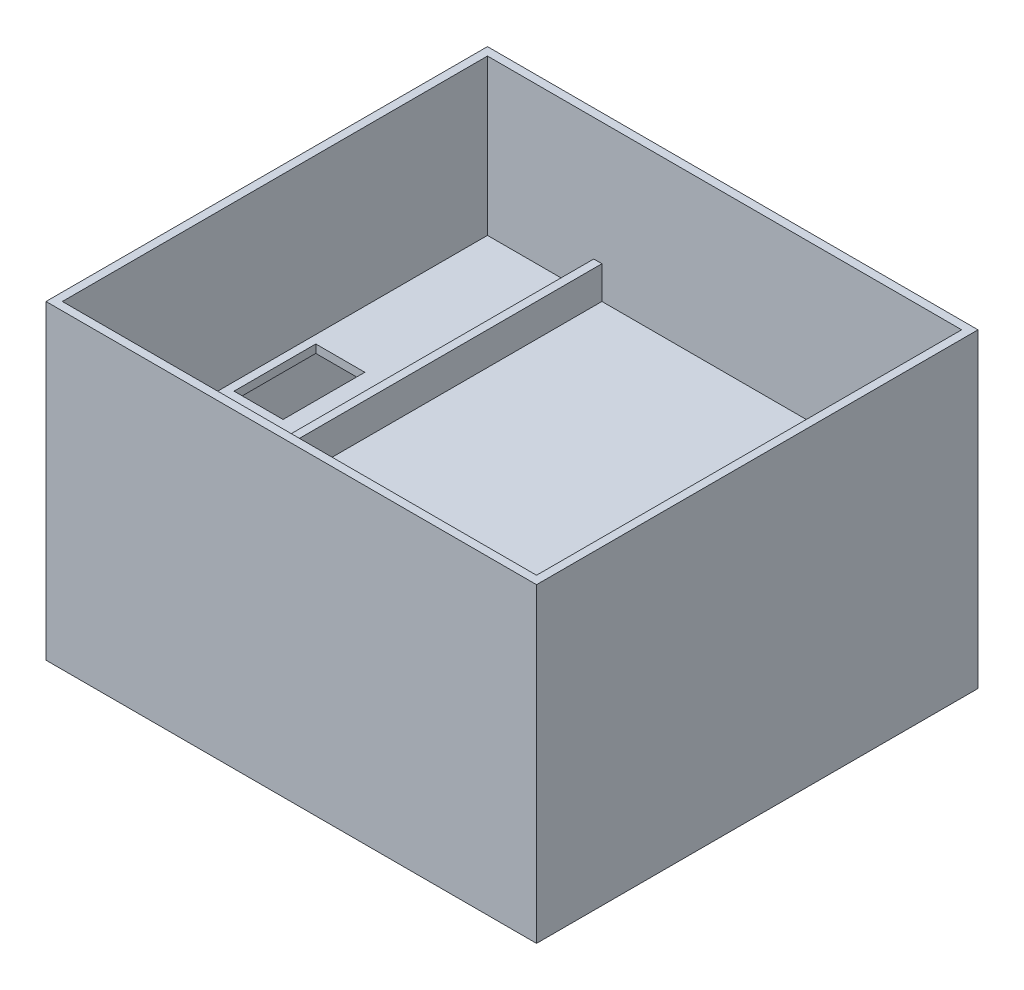
ISO-10303-21;
HEADER;
FILE_DESCRIPTION(('STEP AP214'),'2;1');
FILE_NAME('part.step','',(''),(''),'','','');
FILE_SCHEMA(('AUTOMOTIVE_DESIGN { 1 0 10303 214 1 1 1 1 }'));
ENDSEC;
DATA;
#1=APPLICATION_CONTEXT('core data for automotive mechanical design processes');
#2=APPLICATION_PROTOCOL_DEFINITION('international standard','automotive_design',2000,#1);
#3=PRODUCT_CONTEXT('',#1,'mechanical');
#4=PRODUCT('Part','Part','',(#3));
#5=PRODUCT_RELATED_PRODUCT_CATEGORY('part','',(#4));
#6=PRODUCT_DEFINITION_FORMATION('','',#4);
#7=PRODUCT_DEFINITION_CONTEXT('part definition',#1,'design');
#8=PRODUCT_DEFINITION('design','',#6,#7);
#9=PRODUCT_DEFINITION_SHAPE('','',#8);
#10=(LENGTH_UNIT() NAMED_UNIT(*) SI_UNIT(.MILLI.,.METRE.));
#11=(NAMED_UNIT(*) PLANE_ANGLE_UNIT() SI_UNIT($,.RADIAN.));
#12=(NAMED_UNIT(*) SI_UNIT($,.STERADIAN.) SOLID_ANGLE_UNIT());
#13=UNCERTAINTY_MEASURE_WITH_UNIT(LENGTH_MEASURE(1.E-05),#10,'distance_accuracy_value','');
#14=(GEOMETRIC_REPRESENTATION_CONTEXT(3) GLOBAL_UNCERTAINTY_ASSIGNED_CONTEXT((#13)) GLOBAL_UNIT_ASSIGNED_CONTEXT((#10,
#11,#12)) REPRESENTATION_CONTEXT('',''));
#15=CARTESIAN_POINT('',(0.,0.,0.));
#16=DIRECTION('',(0.,0.,1.));
#17=DIRECTION('',(1.,0.,0.));
#18=AXIS2_PLACEMENT_3D('',#15,#16,#17);
#19=CARTESIAN_POINT('',(-111.874465942488,56.,39.9464352017778));
#20=DIRECTION('',(-1.,0.,0.));
#21=DIRECTION('',(0.,0.,1.));
#22=AXIS2_PLACEMENT_3D('',#19,#20,#21);
#23=PLANE('',#22);
#24=DIRECTION('',(0.,0.,-1.));
#25=VECTOR('',#24,1.);
#26=CARTESIAN_POINT('',(-111.874465942488,19.,39.9464352017778));
#27=LINE('',#26,#25);
#28=CARTESIAN_POINT('',(-111.874465942488,19.,39.9464352017778));
#29=VERTEX_POINT('',#28);
#30=CARTESIAN_POINT('',(-111.874465942488,19.,29.9464352017778));
#31=VERTEX_POINT('',#30);
#32=EDGE_CURVE('E47',#29,#31,#27,.T.);
#33=ORIENTED_EDGE('',*,*,#32,.F.);
#34=DIRECTION('',(0.,-1.,0.));
#35=VECTOR('',#34,1.);
#36=CARTESIAN_POINT('',(-111.874465942488,56.,39.9464352017778));
#37=LINE('',#36,#35);
#38=CARTESIAN_POINT('',(-111.874465942488,18.,39.9464352017778));
#39=VERTEX_POINT('',#38);
#40=EDGE_CURVE('E232',#29,#39,#37,.T.);
#41=ORIENTED_EDGE('',*,*,#40,.T.);
#42=DIRECTION('',(0.,0.,-1.));
#43=VECTOR('',#42,1.);
#44=CARTESIAN_POINT('',(-111.874465942488,18.,39.9464352017778));
#45=LINE('',#44,#43);
#46=CARTESIAN_POINT('',(-111.874465942488,18.,29.9464352017778));
#47=VERTEX_POINT('',#46);
#48=EDGE_CURVE('E182',#39,#47,#45,.T.);
#49=ORIENTED_EDGE('',*,*,#48,.T.);
#50=DIRECTION('',(0.,-1.,0.));
#51=VECTOR('',#50,1.);
#52=CARTESIAN_POINT('',(-111.874465942488,56.,29.9464352017778));
#53=LINE('',#52,#51);
#54=EDGE_CURVE('E231',#31,#47,#53,.T.);
#55=ORIENTED_EDGE('',*,*,#54,.F.);
#56=EDGE_LOOP('',(#33,#41,#49,#55));
#57=FACE_BOUND('',#56,.T.);
#58=ADVANCED_FACE('F33',(#57),#23,.F.);
#59=CARTESIAN_POINT('',(-111.874465942488,56.,39.9464352017778));
#60=DIRECTION('',(0.,0.,1.));
#61=DIRECTION('',(1.,0.,0.));
#62=AXIS2_PLACEMENT_3D('',#59,#60,#61);
#63=PLANE('',#62);
#64=DIRECTION('',(-1.,0.,0.));
#65=VECTOR('',#64,1.);
#66=CARTESIAN_POINT('',(-111.874465942488,19.,39.9464352017778));
#67=LINE('',#66,#65);
#68=CARTESIAN_POINT('',(-105.874465942488,19.,39.9464352017778));
#69=VERTEX_POINT('',#68);
#70=EDGE_CURVE('E210',#69,#29,#67,.T.);
#71=ORIENTED_EDGE('',*,*,#70,.F.);
#72=DIRECTION('',(0.,-1.,0.));
#73=VECTOR('',#72,1.);
#74=CARTESIAN_POINT('',(-105.874465942488,56.,39.9464352017778));
#75=LINE('',#74,#73);
#76=CARTESIAN_POINT('',(-105.874465942488,18.,39.9464352017778));
#77=VERTEX_POINT('',#76);
#78=EDGE_CURVE('E235',#69,#77,#75,.T.);
#79=ORIENTED_EDGE('',*,*,#78,.T.);
#80=DIRECTION('',(-1.,0.,0.));
#81=VECTOR('',#80,1.);
#82=CARTESIAN_POINT('',(-111.874465942488,18.,39.9464352017778));
#83=LINE('',#82,#81);
#84=EDGE_CURVE('E228',#77,#39,#83,.T.);
#85=ORIENTED_EDGE('',*,*,#84,.T.);
#86=ORIENTED_EDGE('',*,*,#40,.F.);
#87=EDGE_LOOP('',(#71,#79,#85,#86));
#88=FACE_BOUND('',#87,.T.);
#89=ADVANCED_FACE('F361',(#88),#63,.F.);
#90=CARTESIAN_POINT('',(-105.874465942488,56.,39.9464352017778));
#91=DIRECTION('',(1.,0.,0.));
#92=DIRECTION('',(0.,0.,-1.));
#93=AXIS2_PLACEMENT_3D('',#90,#91,#92);
#94=PLANE('',#93);
#95=DIRECTION('',(0.,0.,1.));
#96=VECTOR('',#95,1.);
#97=CARTESIAN_POINT('',(-105.874465942488,19.,39.9464352017778));
#98=LINE('',#97,#96);
#99=CARTESIAN_POINT('',(-105.874465942488,19.,29.9464352017778));
#100=VERTEX_POINT('',#99);
#101=EDGE_CURVE('E207',#100,#69,#98,.T.);
#102=ORIENTED_EDGE('',*,*,#101,.F.);
#103=DIRECTION('',(0.,-1.,0.));
#104=VECTOR('',#103,1.);
#105=CARTESIAN_POINT('',(-105.874465942488,56.,29.9464352017778));
#106=LINE('',#105,#104);
#107=CARTESIAN_POINT('',(-105.874465942488,18.,29.9464352017778));
#108=VERTEX_POINT('',#107);
#109=EDGE_CURVE('E237',#100,#108,#106,.T.);
#110=ORIENTED_EDGE('',*,*,#109,.T.);
#111=DIRECTION('',(0.,0.,1.));
#112=VECTOR('',#111,1.);
#113=CARTESIAN_POINT('',(-105.874465942488,18.,39.9464352017778));
#114=LINE('',#113,#112);
#115=EDGE_CURVE('E225',#108,#77,#114,.T.);
#116=ORIENTED_EDGE('',*,*,#115,.T.);
#117=ORIENTED_EDGE('',*,*,#78,.F.);
#118=EDGE_LOOP('',(#102,#110,#116,#117));
#119=FACE_BOUND('',#118,.T.);
#120=ADVANCED_FACE('F367',(#119),#94,.F.);
#121=CARTESIAN_POINT('',(-111.874465942488,56.,29.9464352017778));
#122=DIRECTION('',(0.,0.,-1.));
#123=DIRECTION('',(-1.,0.,0.));
#124=AXIS2_PLACEMENT_3D('',#121,#122,#123);
#125=PLANE('',#124);
#126=DIRECTION('',(1.,0.,0.));
#127=VECTOR('',#126,1.);
#128=CARTESIAN_POINT('',(-111.874465942488,19.,29.9464352017778));
#129=LINE('',#128,#127);
#130=EDGE_CURVE('E11',#31,#100,#129,.T.);
#131=ORIENTED_EDGE('',*,*,#130,.F.);
#132=ORIENTED_EDGE('',*,*,#54,.T.);
#133=DIRECTION('',(1.,0.,0.));
#134=VECTOR('',#133,1.);
#135=CARTESIAN_POINT('',(-111.874465942488,18.,29.9464352017778));
#136=LINE('',#135,#134);
#137=EDGE_CURVE('E222',#47,#108,#136,.T.);
#138=ORIENTED_EDGE('',*,*,#137,.T.);
#139=ORIENTED_EDGE('',*,*,#109,.F.);
#140=EDGE_LOOP('',(#131,#132,#138,#139));
#141=FACE_BOUND('',#140,.T.);
#142=ADVANCED_FACE('F372',(#141),#125,.F.);
#143=CARTESIAN_POINT('',(-98.8744659424876,19.,7.9464352017778));
#144=DIRECTION('',(-1.,0.,0.));
#145=DIRECTION('',(0.,0.,1.));
#146=AXIS2_PLACEMENT_3D('',#143,#144,#145);
#147=PLANE('',#146);
#148=DIRECTION('',(0.,0.,-1.));
#149=VECTOR('',#148,1.);
#150=CARTESIAN_POINT('',(-98.8744659424876,23.,59.9464352017778));
#151=LINE('',#150,#149);
#152=CARTESIAN_POINT('',(-98.8744659424876,23.,59.9464352017778));
#153=VERTEX_POINT('',#152);
#154=CARTESIAN_POINT('',(-98.8744659424876,23.,7.9464352017778));
#155=VERTEX_POINT('',#154);
#156=EDGE_CURVE('E55',#153,#155,#151,.T.);
#157=ORIENTED_EDGE('',*,*,#156,.F.);
#158=DIRECTION('',(0.,1.,0.));
#159=VECTOR('',#158,1.);
#160=CARTESIAN_POINT('',(-98.8744659424876,19.,59.9464352017778));
#161=LINE('',#160,#159);
#162=CARTESIAN_POINT('',(-98.8744659424876,19.,59.9464352017778));
#163=VERTEX_POINT('',#162);
#164=EDGE_CURVE('E293',#163,#153,#161,.T.);
#165=ORIENTED_EDGE('',*,*,#164,.F.);
#166=DIRECTION('',(0.,0.,1.));
#167=VECTOR('',#166,1.);
#168=CARTESIAN_POINT('',(-98.8744659424876,19.,7.9464352017778));
#169=LINE('',#168,#167);
#170=CARTESIAN_POINT('',(-98.8744659424876,19.,7.9464352017778));
#171=VERTEX_POINT('',#170);
#172=EDGE_CURVE('E279',#171,#163,#169,.T.);
#173=ORIENTED_EDGE('',*,*,#172,.F.);
#174=DIRECTION('',(0.,1.,0.));
#175=VECTOR('',#174,1.);
#176=CARTESIAN_POINT('',(-98.8744659424876,19.,7.9464352017778));
#177=LINE('',#176,#175);
#178=EDGE_CURVE('E296',#171,#155,#177,.T.);
#179=ORIENTED_EDGE('',*,*,#178,.T.);
#180=EDGE_LOOP('',(#157,#165,#173,#179));
#181=FACE_BOUND('',#180,.T.);
#182=ADVANCED_FACE('F402',(#181),#147,.F.);
#183=CARTESIAN_POINT('',(-113.874465942488,38.,60.9464352017778));
#184=DIRECTION('',(1.,0.,0.));
#185=DIRECTION('',(0.,0.,-1.));
#186=AXIS2_PLACEMENT_3D('',#183,#184,#185);
#187=PLANE('',#186);
#188=DIRECTION('',(0.,0.,1.));
#189=VECTOR('',#188,1.);
#190=CARTESIAN_POINT('',(-113.874465942488,0.,60.9464352017778));
#191=LINE('',#190,#189);
#192=CARTESIAN_POINT('',(-113.874465942488,0.,6.9464352017778));
#193=VERTEX_POINT('',#192);
#194=CARTESIAN_POINT('',(-113.874465942488,0.,60.9464352017778));
#195=VERTEX_POINT('',#194);
#196=EDGE_CURVE('E292',#193,#195,#191,.T.);
#197=ORIENTED_EDGE('',*,*,#196,.T.);
#198=DIRECTION('',(0.,-1.,0.));
#199=VECTOR('',#198,1.);
#200=CARTESIAN_POINT('',(-113.874465942488,38.,60.9464352017778));
#201=LINE('',#200,#199);
#202=CARTESIAN_POINT('',(-113.874465942488,38.,60.9464352017778));
#203=VERTEX_POINT('',#202);
#204=EDGE_CURVE('E41',#203,#195,#201,.T.);
#205=ORIENTED_EDGE('',*,*,#204,.F.);
#206=DIRECTION('',(0.,0.,1.));
#207=VECTOR('',#206,1.);
#208=CARTESIAN_POINT('',(-113.874465942488,38.,60.9464352017778));
#209=LINE('',#208,#207);
#210=CARTESIAN_POINT('',(-113.874465942488,38.,6.9464352017778));
#211=VERTEX_POINT('',#210);
#212=EDGE_CURVE('E301',#211,#203,#209,.T.);
#213=ORIENTED_EDGE('',*,*,#212,.F.);
#214=DIRECTION('',(0.,-1.,0.));
#215=VECTOR('',#214,1.);
#216=CARTESIAN_POINT('',(-113.874465942488,38.,6.9464352017778));
#217=LINE('',#216,#215);
#218=EDGE_CURVE('E311',#211,#193,#217,.T.);
#219=ORIENTED_EDGE('',*,*,#218,.T.);
#220=EDGE_LOOP('',(#197,#205,#213,#219));
#221=FACE_BOUND('',#220,.T.);
#222=ADVANCED_FACE('F35',(#221),#187,.F.);
#223=CARTESIAN_POINT('',(-113.874465942488,38.,60.9464352017778));
#224=DIRECTION('',(0.,0.,-1.));
#225=DIRECTION('',(-1.,0.,0.));
#226=AXIS2_PLACEMENT_3D('',#223,#224,#225);
#227=PLANE('',#226);
#228=DIRECTION('',(1.,0.,0.));
#229=VECTOR('',#228,1.);
#230=CARTESIAN_POINT('',(-113.874465942488,0.,60.9464352017778));
#231=LINE('',#230,#229);
#232=CARTESIAN_POINT('',(-53.8744659424876,0.,60.9464352017778));
#233=VERTEX_POINT('',#232);
#234=EDGE_CURVE('E314',#195,#233,#231,.T.);
#235=ORIENTED_EDGE('',*,*,#234,.T.);
#236=DIRECTION('',(0.,-1.,0.));
#237=VECTOR('',#236,1.);
#238=CARTESIAN_POINT('',(-53.8744659424876,38.,60.9464352017778));
#239=LINE('',#238,#237);
#240=CARTESIAN_POINT('',(-53.8744659424876,38.,60.9464352017778));
#241=VERTEX_POINT('',#240);
#242=EDGE_CURVE('E324',#241,#233,#239,.T.);
#243=ORIENTED_EDGE('',*,*,#242,.F.);
#244=DIRECTION('',(1.,0.,0.));
#245=VECTOR('',#244,1.);
#246=CARTESIAN_POINT('',(-113.874465942488,38.,60.9464352017778));
#247=LINE('',#246,#245);
#248=EDGE_CURVE('E304',#203,#241,#247,.T.);
#249=ORIENTED_EDGE('',*,*,#248,.F.);
#250=ORIENTED_EDGE('',*,*,#204,.T.);
#251=EDGE_LOOP('',(#235,#243,#249,#250));
#252=FACE_BOUND('',#251,.T.);
#253=ADVANCED_FACE('F329',(#252),#227,.F.);
#254=CARTESIAN_POINT('',(-53.8744659424876,38.,60.9464352017778));
#255=DIRECTION('',(-1.,0.,0.));
#256=DIRECTION('',(0.,0.,1.));
#257=AXIS2_PLACEMENT_3D('',#254,#255,#256);
#258=PLANE('',#257);
#259=DIRECTION('',(0.,0.,-1.));
#260=VECTOR('',#259,1.);
#261=CARTESIAN_POINT('',(-53.8744659424876,0.,60.9464352017778));
#262=LINE('',#261,#260);
#263=CARTESIAN_POINT('',(-53.8744659424876,0.,6.9464352017778));
#264=VERTEX_POINT('',#263);
#265=EDGE_CURVE('E316',#233,#264,#262,.T.);
#266=ORIENTED_EDGE('',*,*,#265,.T.);
#267=DIRECTION('',(0.,-1.,0.));
#268=VECTOR('',#267,1.);
#269=CARTESIAN_POINT('',(-53.8744659424876,38.,6.9464352017778));
#270=LINE('',#269,#268);
#271=CARTESIAN_POINT('',(-53.8744659424876,38.,6.9464352017778));
#272=VERTEX_POINT('',#271);
#273=EDGE_CURVE('E321',#272,#264,#270,.T.);
#274=ORIENTED_EDGE('',*,*,#273,.F.);
#275=DIRECTION('',(0.,0.,-1.));
#276=VECTOR('',#275,1.);
#277=CARTESIAN_POINT('',(-53.8744659424876,38.,60.9464352017778));
#278=LINE('',#277,#276);
#279=EDGE_CURVE('E307',#241,#272,#278,.T.);
#280=ORIENTED_EDGE('',*,*,#279,.F.);
#281=ORIENTED_EDGE('',*,*,#242,.T.);
#282=EDGE_LOOP('',(#266,#274,#280,#281));
#283=FACE_BOUND('',#282,.T.);
#284=ADVANCED_FACE('F341',(#283),#258,.F.);
#285=CARTESIAN_POINT('',(-113.874465942488,38.,6.9464352017778));
#286=DIRECTION('',(0.,0.,1.));
#287=DIRECTION('',(1.,0.,0.));
#288=AXIS2_PLACEMENT_3D('',#285,#286,#287);
#289=PLANE('',#288);
#290=DIRECTION('',(-1.,0.,0.));
#291=VECTOR('',#290,1.);
#292=CARTESIAN_POINT('',(-113.874465942488,0.,6.9464352017778));
#293=LINE('',#292,#291);
#294=EDGE_CURVE('E305',#264,#193,#293,.T.);
#295=ORIENTED_EDGE('',*,*,#294,.T.);
#296=ORIENTED_EDGE('',*,*,#218,.F.);
#297=DIRECTION('',(-1.,0.,0.));
#298=VECTOR('',#297,1.);
#299=CARTESIAN_POINT('',(-113.874465942488,38.,6.9464352017778));
#300=LINE('',#299,#298);
#301=EDGE_CURVE('E309',#272,#211,#300,.T.);
#302=ORIENTED_EDGE('',*,*,#301,.F.);
#303=ORIENTED_EDGE('',*,*,#273,.T.);
#304=EDGE_LOOP('',(#295,#296,#302,#303));
#305=FACE_BOUND('',#304,.T.);
#306=ADVANCED_FACE('F345',(#305),#289,.F.);
#307=CARTESIAN_POINT('',(0.,38.,0.));
#308=DIRECTION('',(0.,-1.,0.));
#309=DIRECTION('',(0.,0.,-1.));
#310=AXIS2_PLACEMENT_3D('',#307,#308,#309);
#311=PLANE('',#310);
#312=DIRECTION('',(1.,0.,0.));
#313=VECTOR('',#312,1.);
#314=CARTESIAN_POINT('',(-54.8744659424876,38.,59.9464352017778));
#315=LINE('',#314,#313);
#316=CARTESIAN_POINT('',(-112.874465942488,38.,59.9464352017778));
#317=VERTEX_POINT('',#316);
#318=CARTESIAN_POINT('',(-54.8744659424876,38.,59.9464352017778));
#319=VERTEX_POINT('',#318);
#320=EDGE_CURVE('E276',#317,#319,#315,.T.);
#321=ORIENTED_EDGE('',*,*,#320,.F.);
#322=DIRECTION('',(0.,0.,1.));
#323=VECTOR('',#322,1.);
#324=CARTESIAN_POINT('',(-112.874465942488,38.,59.9464352017778));
#325=LINE('',#324,#323);
#326=CARTESIAN_POINT('',(-112.874465942488,38.,7.9464352017778));
#327=VERTEX_POINT('',#326);
#328=EDGE_CURVE('E179',#327,#317,#325,.T.);
#329=ORIENTED_EDGE('',*,*,#328,.F.);
#330=DIRECTION('',(-1.,0.,0.));
#331=VECTOR('',#330,1.);
#332=CARTESIAN_POINT('',(-54.8744659424876,38.,7.9464352017778));
#333=LINE('',#332,#331);
#334=CARTESIAN_POINT('',(-54.8744659424876,38.,7.9464352017778));
#335=VERTEX_POINT('',#334);
#336=EDGE_CURVE('E287',#335,#327,#333,.T.);
#337=ORIENTED_EDGE('',*,*,#336,.F.);
#338=DIRECTION('',(0.,0.,-1.));
#339=VECTOR('',#338,1.);
#340=CARTESIAN_POINT('',(-54.8744659424876,38.,7.9464352017778));
#341=LINE('',#340,#339);
#342=EDGE_CURVE('E265',#319,#335,#341,.T.);
#343=ORIENTED_EDGE('',*,*,#342,.F.);
#344=EDGE_LOOP('',(#321,#329,#337,#343));
#345=FACE_BOUND('',#344,.T.);
#346=ORIENTED_EDGE('',*,*,#212,.T.);
#347=ORIENTED_EDGE('',*,*,#248,.T.);
#348=ORIENTED_EDGE('',*,*,#279,.T.);
#349=ORIENTED_EDGE('',*,*,#301,.T.);
#350=EDGE_LOOP('',(#346,#347,#348,#349));
#351=FACE_BOUND('',#350,.T.);
#352=ADVANCED_FACE('F347',(#345,#351),#311,.F.);
#353=CARTESIAN_POINT('',(0.,0.,0.));
#354=DIRECTION('',(0.,-1.,0.));
#355=DIRECTION('',(0.,0.,-1.));
#356=AXIS2_PLACEMENT_3D('',#353,#354,#355);
#357=PLANE('',#356);
#358=DIRECTION('',(0.,0.,-1.));
#359=VECTOR('',#358,1.);
#360=CARTESIAN_POINT('',(-112.874465942488,0.,59.9464352017778));
#361=LINE('',#360,#359);
#362=CARTESIAN_POINT('',(-112.874465942488,0.,59.9464352017778));
#363=VERTEX_POINT('',#362);
#364=CARTESIAN_POINT('',(-112.874465942488,0.,7.9464352017778));
#365=VERTEX_POINT('',#364);
#366=EDGE_CURVE('E234',#363,#365,#361,.T.);
#367=ORIENTED_EDGE('',*,*,#366,.F.);
#368=DIRECTION('',(-1.,0.,0.));
#369=VECTOR('',#368,1.);
#370=CARTESIAN_POINT('',(-112.874465942488,0.,59.9464352017778));
#371=LINE('',#370,#369);
#372=CARTESIAN_POINT('',(-77.8744659424876,0.,59.9464352017778));
#373=VERTEX_POINT('',#372);
#374=EDGE_CURVE('E244',#373,#363,#371,.T.);
#375=ORIENTED_EDGE('',*,*,#374,.F.);
#376=DIRECTION('',(0.,0.,1.));
#377=VECTOR('',#376,1.);
#378=CARTESIAN_POINT('',(-77.8744659424876,0.,59.9464352017778));
#379=LINE('',#378,#377);
#380=CARTESIAN_POINT('',(-77.8744659424876,0.,7.9464352017778));
#381=VERTEX_POINT('',#380);
#382=EDGE_CURVE('E258',#381,#373,#379,.T.);
#383=ORIENTED_EDGE('',*,*,#382,.F.);
#384=DIRECTION('',(1.,0.,0.));
#385=VECTOR('',#384,1.);
#386=CARTESIAN_POINT('',(-112.874465942488,0.,7.9464352017778));
#387=LINE('',#386,#385);
#388=EDGE_CURVE('E255',#365,#381,#387,.T.);
#389=ORIENTED_EDGE('',*,*,#388,.F.);
#390=EDGE_LOOP('',(#367,#375,#383,#389));
#391=FACE_BOUND('',#390,.T.);
#392=ORIENTED_EDGE('',*,*,#196,.F.);
#393=ORIENTED_EDGE('',*,*,#294,.F.);
#394=ORIENTED_EDGE('',*,*,#265,.F.);
#395=ORIENTED_EDGE('',*,*,#234,.F.);
#396=EDGE_LOOP('',(#392,#393,#394,#395));
#397=FACE_BOUND('',#396,.T.);
#398=ADVANCED_FACE('F337',(#391,#397),#357,.T.);
#399=CARTESIAN_POINT('',(-54.8744659424876,19.,7.9464352017778));
#400=DIRECTION('',(1.,0.,0.));
#401=DIRECTION('',(0.,0.,-1.));
#402=AXIS2_PLACEMENT_3D('',#399,#400,#401);
#403=PLANE('',#402);
#404=ORIENTED_EDGE('',*,*,#342,.T.);
#405=DIRECTION('',(0.,1.,0.));
#406=VECTOR('',#405,1.);
#407=CARTESIAN_POINT('',(-54.8744659424876,19.,7.9464352017778));
#408=LINE('',#407,#406);
#409=CARTESIAN_POINT('',(-54.8744659424876,19.,7.9464352017778));
#410=VERTEX_POINT('',#409);
#411=EDGE_CURVE('E285',#410,#335,#408,.T.);
#412=ORIENTED_EDGE('',*,*,#411,.F.);
#413=DIRECTION('',(0.,0.,-1.));
#414=VECTOR('',#413,1.);
#415=CARTESIAN_POINT('',(-54.8744659424876,19.,7.9464352017778));
#416=LINE('',#415,#414);
#417=CARTESIAN_POINT('',(-54.8744659424876,19.,59.9464352017778));
#418=VERTEX_POINT('',#417);
#419=EDGE_CURVE('E272',#418,#410,#416,.T.);
#420=ORIENTED_EDGE('',*,*,#419,.F.);
#421=DIRECTION('',(0.,1.,0.));
#422=VECTOR('',#421,1.);
#423=CARTESIAN_POINT('',(-54.8744659424876,19.,59.9464352017778));
#424=LINE('',#423,#422);
#425=EDGE_CURVE('E290',#418,#319,#424,.T.);
#426=ORIENTED_EDGE('',*,*,#425,.T.);
#427=EDGE_LOOP('',(#404,#412,#420,#426));
#428=FACE_BOUND('',#427,.T.);
#429=ADVANCED_FACE('F355',(#428),#403,.F.);
#430=CARTESIAN_POINT('',(-54.8744659424876,19.,59.9464352017778));
#431=DIRECTION('',(0.,0.,1.));
#432=DIRECTION('',(1.,0.,0.));
#433=AXIS2_PLACEMENT_3D('',#430,#431,#432);
#434=PLANE('',#433);
#435=ORIENTED_EDGE('',*,*,#320,.T.);
#436=ORIENTED_EDGE('',*,*,#425,.F.);
#437=DIRECTION('',(1.,0.,0.));
#438=VECTOR('',#437,1.);
#439=CARTESIAN_POINT('',(-54.8744659424876,19.,59.9464352017778));
#440=LINE('',#439,#438);
#441=EDGE_CURVE('E282',#163,#418,#440,.T.);
#442=ORIENTED_EDGE('',*,*,#441,.F.);
#443=ORIENTED_EDGE('',*,*,#164,.T.);
#444=DIRECTION('',(1.,0.,0.));
#445=VECTOR('',#444,1.);
#446=CARTESIAN_POINT('',(-98.8744659424876,23.,59.9464352017778));
#447=LINE('',#446,#445);
#448=CARTESIAN_POINT('',(-99.8744659424876,23.,59.9464352017778));
#449=VERTEX_POINT('',#448);
#450=EDGE_CURVE('E216',#449,#153,#447,.T.);
#451=ORIENTED_EDGE('',*,*,#450,.F.);
#452=DIRECTION('',(0.,1.,0.));
#453=VECTOR('',#452,1.);
#454=CARTESIAN_POINT('',(-99.8744659424876,19.,59.9464352017778));
#455=LINE('',#454,#453);
#456=CARTESIAN_POINT('',(-99.8744659424876,19.,59.9464352017778));
#457=VERTEX_POINT('',#456);
#458=EDGE_CURVE('E189',#457,#449,#455,.T.);
#459=ORIENTED_EDGE('',*,*,#458,.F.);
#460=DIRECTION('',(1.,0.,0.));
#461=VECTOR('',#460,1.);
#462=CARTESIAN_POINT('',(-112.874465942488,19.,59.9464352017778));
#463=LINE('',#462,#461);
#464=CARTESIAN_POINT('',(-112.874465942488,19.,59.9464352017778));
#465=VERTEX_POINT('',#464);
#466=EDGE_CURVE('E186',#465,#457,#463,.T.);
#467=ORIENTED_EDGE('',*,*,#466,.F.);
#468=DIRECTION('',(0.,1.,0.));
#469=VECTOR('',#468,1.);
#470=CARTESIAN_POINT('',(-112.874465942488,23.,59.9464352017778));
#471=LINE('',#470,#469);
#472=EDGE_CURVE('E171',#465,#317,#471,.T.);
#473=ORIENTED_EDGE('',*,*,#472,.T.);
#474=EDGE_LOOP('',(#435,#436,#442,#443,#451,#459,#467,#473));
#475=FACE_BOUND('',#474,.T.);
#476=ADVANCED_FACE('F187',(#475),#434,.F.);
#477=CARTESIAN_POINT('',(-54.8744659424876,19.,7.9464352017778));
#478=DIRECTION('',(0.,0.,-1.));
#479=DIRECTION('',(-1.,0.,0.));
#480=AXIS2_PLACEMENT_3D('',#477,#478,#479);
#481=PLANE('',#480);
#482=ORIENTED_EDGE('',*,*,#336,.T.);
#483=DIRECTION('',(0.,1.,0.));
#484=VECTOR('',#483,1.);
#485=CARTESIAN_POINT('',(-112.874465942488,23.,7.9464352017778));
#486=LINE('',#485,#484);
#487=CARTESIAN_POINT('',(-112.874465942488,19.,7.9464352017778));
#488=VERTEX_POINT('',#487);
#489=EDGE_CURVE('E183',#488,#327,#486,.T.);
#490=ORIENTED_EDGE('',*,*,#489,.F.);
#491=DIRECTION('',(-1.,0.,0.));
#492=VECTOR('',#491,1.);
#493=CARTESIAN_POINT('',(-112.874465942488,19.,7.9464352017778));
#494=LINE('',#493,#492);
#495=CARTESIAN_POINT('',(-99.8744659424876,19.,7.9464352017778));
#496=VERTEX_POINT('',#495);
#497=EDGE_CURVE('E197',#496,#488,#494,.T.);
#498=ORIENTED_EDGE('',*,*,#497,.F.);
#499=DIRECTION('',(0.,1.,0.));
#500=VECTOR('',#499,1.);
#501=CARTESIAN_POINT('',(-99.8744659424876,19.,7.9464352017778));
#502=LINE('',#501,#500);
#503=CARTESIAN_POINT('',(-99.8744659424876,23.,7.9464352017778));
#504=VERTEX_POINT('',#503);
#505=EDGE_CURVE('E205',#496,#504,#502,.T.);
#506=ORIENTED_EDGE('',*,*,#505,.T.);
#507=DIRECTION('',(-1.,0.,0.));
#508=VECTOR('',#507,1.);
#509=CARTESIAN_POINT('',(-98.8744659424876,23.,7.9464352017778));
#510=LINE('',#509,#508);
#511=EDGE_CURVE('E214',#155,#504,#510,.T.);
#512=ORIENTED_EDGE('',*,*,#511,.F.);
#513=ORIENTED_EDGE('',*,*,#178,.F.);
#514=DIRECTION('',(-1.,0.,0.));
#515=VECTOR('',#514,1.);
#516=CARTESIAN_POINT('',(-54.8744659424876,19.,7.9464352017778));
#517=LINE('',#516,#515);
#518=EDGE_CURVE('E275',#410,#171,#517,.T.);
#519=ORIENTED_EDGE('',*,*,#518,.F.);
#520=ORIENTED_EDGE('',*,*,#411,.T.);
#521=EDGE_LOOP('',(#482,#490,#498,#506,#512,#513,#519,#520));
#522=FACE_BOUND('',#521,.T.);
#523=ADVANCED_FACE('F398',(#522),#481,.F.);
#524=CARTESIAN_POINT('',(0.,19.,0.));
#525=DIRECTION('',(0.,-1.,0.));
#526=DIRECTION('',(0.,0.,-1.));
#527=AXIS2_PLACEMENT_3D('',#524,#525,#526);
#528=PLANE('',#527);
#529=ORIENTED_EDGE('',*,*,#419,.T.);
#530=ORIENTED_EDGE('',*,*,#518,.T.);
#531=ORIENTED_EDGE('',*,*,#172,.T.);
#532=ORIENTED_EDGE('',*,*,#441,.T.);
#533=EDGE_LOOP('',(#529,#530,#531,#532));
#534=FACE_BOUND('',#533,.T.);
#535=ADVANCED_FACE('F394',(#534),#528,.F.);
#536=CARTESIAN_POINT('',(-112.874465942488,18.,59.9464352017778));
#537=DIRECTION('',(-1.,0.,0.));
#538=DIRECTION('',(0.,0.,1.));
#539=AXIS2_PLACEMENT_3D('',#536,#537,#538);
#540=PLANE('',#539);
#541=ORIENTED_EDGE('',*,*,#366,.T.);
#542=DIRECTION('',(0.,-1.,0.));
#543=VECTOR('',#542,1.);
#544=CARTESIAN_POINT('',(-112.874465942488,18.,7.9464352017778));
#545=LINE('',#544,#543);
#546=CARTESIAN_POINT('',(-112.874465942488,18.,7.9464352017778));
#547=VERTEX_POINT('',#546);
#548=EDGE_CURVE('E253',#547,#365,#545,.T.);
#549=ORIENTED_EDGE('',*,*,#548,.F.);
#550=DIRECTION('',(0.,0.,-1.));
#551=VECTOR('',#550,1.);
#552=CARTESIAN_POINT('',(-112.874465942488,18.,59.9464352017778));
#553=LINE('',#552,#551);
#554=CARTESIAN_POINT('',(-112.874465942488,18.,59.9464352017778));
#555=VERTEX_POINT('',#554);
#556=EDGE_CURVE('E240',#555,#547,#553,.T.);
#557=ORIENTED_EDGE('',*,*,#556,.F.);
#558=DIRECTION('',(0.,-1.,0.));
#559=VECTOR('',#558,1.);
#560=CARTESIAN_POINT('',(-112.874465942488,18.,59.9464352017778));
#561=LINE('',#560,#559);
#562=EDGE_CURVE('E263',#555,#363,#561,.T.);
#563=ORIENTED_EDGE('',*,*,#562,.T.);
#564=EDGE_LOOP('',(#541,#549,#557,#563));
#565=FACE_BOUND('',#564,.T.);
#566=ADVANCED_FACE('F384',(#565),#540,.F.);
#567=CARTESIAN_POINT('',(-112.874465942488,18.,59.9464352017778));
#568=DIRECTION('',(0.,0.,1.));
#569=DIRECTION('',(1.,0.,0.));
#570=AXIS2_PLACEMENT_3D('',#567,#568,#569);
#571=PLANE('',#570);
#572=ORIENTED_EDGE('',*,*,#374,.T.);
#573=ORIENTED_EDGE('',*,*,#562,.F.);
#574=DIRECTION('',(-1.,0.,0.));
#575=VECTOR('',#574,1.);
#576=CARTESIAN_POINT('',(-112.874465942488,18.,59.9464352017778));
#577=LINE('',#576,#575);
#578=CARTESIAN_POINT('',(-77.8744659424876,18.,59.9464352017778));
#579=VERTEX_POINT('',#578);
#580=EDGE_CURVE('E250',#579,#555,#577,.T.);
#581=ORIENTED_EDGE('',*,*,#580,.F.);
#582=DIRECTION('',(0.,-1.,0.));
#583=VECTOR('',#582,1.);
#584=CARTESIAN_POINT('',(-77.8744659424876,18.,59.9464352017778));
#585=LINE('',#584,#583);
#586=EDGE_CURVE('E266',#579,#373,#585,.T.);
#587=ORIENTED_EDGE('',*,*,#586,.T.);
#588=EDGE_LOOP('',(#572,#573,#581,#587));
#589=FACE_BOUND('',#588,.T.);
#590=ADVANCED_FACE('F380',(#589),#571,.F.);
#591=CARTESIAN_POINT('',(-77.8744659424876,18.,59.9464352017778));
#592=DIRECTION('',(1.,0.,0.));
#593=DIRECTION('',(0.,0.,-1.));
#594=AXIS2_PLACEMENT_3D('',#591,#592,#593);
#595=PLANE('',#594);
#596=ORIENTED_EDGE('',*,*,#382,.T.);
#597=ORIENTED_EDGE('',*,*,#586,.F.);
#598=DIRECTION('',(0.,0.,1.));
#599=VECTOR('',#598,1.);
#600=CARTESIAN_POINT('',(-77.8744659424876,18.,59.9464352017778));
#601=LINE('',#600,#599);
#602=CARTESIAN_POINT('',(-77.8744659424876,18.,7.9464352017778));
#603=VERTEX_POINT('',#602);
#604=EDGE_CURVE('E247',#603,#579,#601,.T.);
#605=ORIENTED_EDGE('',*,*,#604,.F.);
#606=DIRECTION('',(0.,-1.,0.));
#607=VECTOR('',#606,1.);
#608=CARTESIAN_POINT('',(-77.8744659424876,18.,7.9464352017778));
#609=LINE('',#608,#607);
#610=EDGE_CURVE('E268',#603,#381,#609,.T.);
#611=ORIENTED_EDGE('',*,*,#610,.T.);
#612=EDGE_LOOP('',(#596,#597,#605,#611));
#613=FACE_BOUND('',#612,.T.);
#614=ADVANCED_FACE('F383',(#613),#595,.F.);
#615=CARTESIAN_POINT('',(-112.874465942488,18.,7.9464352017778));
#616=DIRECTION('',(0.,0.,-1.));
#617=DIRECTION('',(-1.,0.,0.));
#618=AXIS2_PLACEMENT_3D('',#615,#616,#617);
#619=PLANE('',#618);
#620=ORIENTED_EDGE('',*,*,#388,.T.);
#621=ORIENTED_EDGE('',*,*,#610,.F.);
#622=DIRECTION('',(1.,0.,0.));
#623=VECTOR('',#622,1.);
#624=CARTESIAN_POINT('',(-112.874465942488,18.,7.9464352017778));
#625=LINE('',#624,#623);
#626=EDGE_CURVE('E243',#547,#603,#625,.T.);
#627=ORIENTED_EDGE('',*,*,#626,.F.);
#628=ORIENTED_EDGE('',*,*,#548,.T.);
#629=EDGE_LOOP('',(#620,#621,#627,#628));
#630=FACE_BOUND('',#629,.T.);
#631=ADVANCED_FACE('F378',(#630),#619,.F.);
#632=CARTESIAN_POINT('',(0.,18.,0.));
#633=DIRECTION('',(0.,-1.,0.));
#634=DIRECTION('',(0.,0.,-1.));
#635=AXIS2_PLACEMENT_3D('',#632,#633,#634);
#636=PLANE('',#635);
#637=ORIENTED_EDGE('',*,*,#48,.F.);
#638=ORIENTED_EDGE('',*,*,#84,.F.);
#639=ORIENTED_EDGE('',*,*,#115,.F.);
#640=ORIENTED_EDGE('',*,*,#137,.F.);
#641=EDGE_LOOP('',(#637,#638,#639,#640));
#642=FACE_BOUND('',#641,.T.);
#643=ORIENTED_EDGE('',*,*,#556,.T.);
#644=ORIENTED_EDGE('',*,*,#626,.T.);
#645=ORIENTED_EDGE('',*,*,#604,.T.);
#646=ORIENTED_EDGE('',*,*,#580,.T.);
#647=EDGE_LOOP('',(#643,#644,#645,#646));
#648=FACE_BOUND('',#647,.T.);
#649=ADVANCED_FACE('F374',(#642,#648),#636,.T.);
#650=CARTESIAN_POINT('',(0.,23.,0.));
#651=DIRECTION('',(0.,1.,0.));
#652=DIRECTION('',(0.,0.,1.));
#653=AXIS2_PLACEMENT_3D('',#650,#651,#652);
#654=PLANE('',#653);
#655=DIRECTION('',(0.,0.,-1.));
#656=VECTOR('',#655,1.);
#657=CARTESIAN_POINT('',(-99.8744659424876,23.,7.9464352017778));
#658=LINE('',#657,#656);
#659=EDGE_CURVE('E198',#449,#504,#658,.T.);
#660=ORIENTED_EDGE('',*,*,#659,.F.);
#661=ORIENTED_EDGE('',*,*,#450,.T.);
#662=ORIENTED_EDGE('',*,*,#156,.T.);
#663=ORIENTED_EDGE('',*,*,#511,.T.);
#664=EDGE_LOOP('',(#660,#661,#662,#663));
#665=FACE_BOUND('',#664,.T.);
#666=ADVANCED_FACE('F377',(#665),#654,.T.);
#667=CARTESIAN_POINT('',(-112.874465942488,23.,59.9464352017778));
#668=DIRECTION('',(-1.,0.,0.));
#669=DIRECTION('',(0.,0.,1.));
#670=AXIS2_PLACEMENT_3D('',#667,#668,#669);
#671=PLANE('',#670);
#672=ORIENTED_EDGE('',*,*,#328,.T.);
#673=ORIENTED_EDGE('',*,*,#472,.F.);
#674=DIRECTION('',(0.,0.,1.));
#675=VECTOR('',#674,1.);
#676=CARTESIAN_POINT('',(-112.874465942488,19.,7.9464352017778));
#677=LINE('',#676,#675);
#678=EDGE_CURVE('E176',#488,#465,#677,.T.);
#679=ORIENTED_EDGE('',*,*,#678,.F.);
#680=ORIENTED_EDGE('',*,*,#489,.T.);
#681=EDGE_LOOP('',(#672,#673,#679,#680));
#682=FACE_BOUND('',#681,.T.);
#683=ADVANCED_FACE('F173',(#682),#671,.F.);
#684=CARTESIAN_POINT('',(0.,19.,0.));
#685=DIRECTION('',(0.,1.,0.));
#686=DIRECTION('',(0.,0.,1.));
#687=AXIS2_PLACEMENT_3D('',#684,#685,#686);
#688=PLANE('',#687);
#689=ORIENTED_EDGE('',*,*,#678,.T.);
#690=ORIENTED_EDGE('',*,*,#466,.T.);
#691=DIRECTION('',(0.,0.,-1.));
#692=VECTOR('',#691,1.);
#693=CARTESIAN_POINT('',(-99.8744659424876,19.,7.9464352017778));
#694=LINE('',#693,#692);
#695=EDGE_CURVE('E193',#457,#496,#694,.T.);
#696=ORIENTED_EDGE('',*,*,#695,.T.);
#697=ORIENTED_EDGE('',*,*,#497,.T.);
#698=EDGE_LOOP('',(#689,#690,#696,#697));
#699=FACE_BOUND('',#698,.T.);
#700=ORIENTED_EDGE('',*,*,#32,.T.);
#701=ORIENTED_EDGE('',*,*,#130,.T.);
#702=ORIENTED_EDGE('',*,*,#101,.T.);
#703=ORIENTED_EDGE('',*,*,#70,.T.);
#704=EDGE_LOOP('',(#700,#701,#702,#703));
#705=FACE_BOUND('',#704,.T.);
#706=ADVANCED_FACE('F195',(#699,#705),#688,.T.);
#707=CARTESIAN_POINT('',(-99.8744659424876,19.,7.9464352017778));
#708=DIRECTION('',(1.,0.,0.));
#709=DIRECTION('',(0.,0.,-1.));
#710=AXIS2_PLACEMENT_3D('',#707,#708,#709);
#711=PLANE('',#710);
#712=ORIENTED_EDGE('',*,*,#659,.T.);
#713=ORIENTED_EDGE('',*,*,#505,.F.);
#714=ORIENTED_EDGE('',*,*,#695,.F.);
#715=ORIENTED_EDGE('',*,*,#458,.T.);
#716=EDGE_LOOP('',(#712,#713,#714,#715));
#717=FACE_BOUND('',#716,.T.);
#718=ADVANCED_FACE('F420',(#717),#711,.F.);
#719=CLOSED_SHELL('',(#58,#89,#120,#142,#182,#222,#253,#284,#306,#352,#398,#429,#476,#523,#535,
#566,#590,#614,#631,#649,#666,#683,#706,#718));
#720=MANIFOLD_SOLID_BREP('B2',#719);
#721=ADVANCED_BREP_SHAPE_REPRESENTATION('',(#18,#720),#14);
#722=SHAPE_DEFINITION_REPRESENTATION(#9,#721);
ENDSEC;
END-ISO-10303-21;
